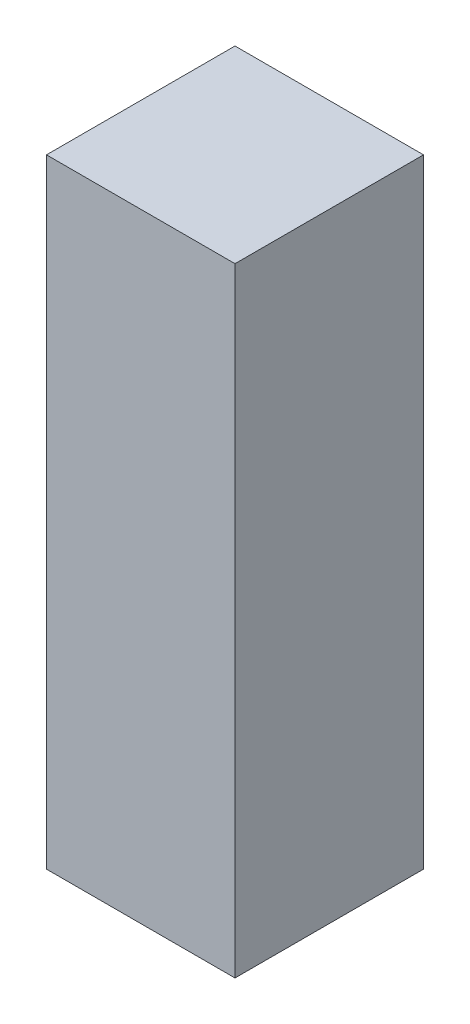
ISO-10303-21;
HEADER;
FILE_DESCRIPTION(('STEP AP214'),'2;1');
FILE_NAME('part.step','',(''),(''),'','','');
FILE_SCHEMA(('AUTOMOTIVE_DESIGN { 1 0 10303 214 1 1 1 1 }'));
ENDSEC;
DATA;
#1=APPLICATION_CONTEXT('core data for automotive mechanical design processes');
#2=APPLICATION_PROTOCOL_DEFINITION('international standard','automotive_design',2000,#1);
#3=PRODUCT_CONTEXT('',#1,'mechanical');
#4=PRODUCT('Part','Part','',(#3));
#5=PRODUCT_RELATED_PRODUCT_CATEGORY('part','',(#4));
#6=PRODUCT_DEFINITION_FORMATION('','',#4);
#7=PRODUCT_DEFINITION_CONTEXT('part definition',#1,'design');
#8=PRODUCT_DEFINITION('design','',#6,#7);
#9=PRODUCT_DEFINITION_SHAPE('','',#8);
#10=(LENGTH_UNIT() NAMED_UNIT(*) SI_UNIT(.MILLI.,.METRE.));
#11=(NAMED_UNIT(*) PLANE_ANGLE_UNIT() SI_UNIT($,.RADIAN.));
#12=(NAMED_UNIT(*) SI_UNIT($,.STERADIAN.) SOLID_ANGLE_UNIT());
#13=UNCERTAINTY_MEASURE_WITH_UNIT(LENGTH_MEASURE(1.E-05),#10,'distance_accuracy_value','');
#14=(GEOMETRIC_REPRESENTATION_CONTEXT(3) GLOBAL_UNCERTAINTY_ASSIGNED_CONTEXT((#13)) GLOBAL_UNIT_ASSIGNED_CONTEXT((#10,
#11,#12)) REPRESENTATION_CONTEXT('',''));
#15=CARTESIAN_POINT('',(0.,0.,0.));
#16=DIRECTION('',(0.,0.,1.));
#17=DIRECTION('',(1.,0.,0.));
#18=AXIS2_PLACEMENT_3D('',#15,#16,#17);
#19=CARTESIAN_POINT('',(0.,233.,0.));
#20=DIRECTION('',(1.,0.,0.));
#21=DIRECTION('',(0.,0.,-1.));
#22=AXIS2_PLACEMENT_3D('',#19,#20,#21);
#23=PLANE('',#22);
#24=DIRECTION('',(0.,0.,1.));
#25=VECTOR('',#24,1.);
#26=CARTESIAN_POINT('',(0.,0.,0.));
#27=LINE('',#26,#25);
#28=CARTESIAN_POINT('',(0.,0.,-71.));
#29=VERTEX_POINT('',#28);
#30=CARTESIAN_POINT('',(0.,0.,0.));
#31=VERTEX_POINT('',#30);
#32=EDGE_CURVE('E99',#29,#31,#27,.T.);
#33=ORIENTED_EDGE('',*,*,#32,.T.);
#34=DIRECTION('',(0.,-1.,0.));
#35=VECTOR('',#34,1.);
#36=CARTESIAN_POINT('',(0.,233.,0.));
#37=LINE('',#36,#35);
#38=CARTESIAN_POINT('',(0.,233.,0.));
#39=VERTEX_POINT('',#38);
#40=EDGE_CURVE('E11',#39,#31,#37,.T.);
#41=ORIENTED_EDGE('',*,*,#40,.F.);
#42=DIRECTION('',(0.,0.,1.));
#43=VECTOR('',#42,1.);
#44=CARTESIAN_POINT('',(0.,233.,0.));
#45=LINE('',#44,#43);
#46=CARTESIAN_POINT('',(0.,233.,-71.));
#47=VERTEX_POINT('',#46);
#48=EDGE_CURVE('E87',#47,#39,#45,.T.);
#49=ORIENTED_EDGE('',*,*,#48,.F.);
#50=DIRECTION('',(0.,-1.,0.));
#51=VECTOR('',#50,1.);
#52=CARTESIAN_POINT('',(0.,233.,-71.));
#53=LINE('',#52,#51);
#54=EDGE_CURVE('E95',#47,#29,#53,.T.);
#55=ORIENTED_EDGE('',*,*,#54,.T.);
#56=EDGE_LOOP('',(#33,#41,#49,#55));
#57=FACE_BOUND('',#56,.T.);
#58=ADVANCED_FACE('F36',(#57),#23,.F.);
#59=CARTESIAN_POINT('',(0.,233.,0.));
#60=DIRECTION('',(0.,0.,-1.));
#61=DIRECTION('',(-1.,0.,0.));
#62=AXIS2_PLACEMENT_3D('',#59,#60,#61);
#63=PLANE('',#62);
#64=DIRECTION('',(1.,0.,0.));
#65=VECTOR('',#64,1.);
#66=CARTESIAN_POINT('',(0.,0.,0.));
#67=LINE('',#66,#65);
#68=CARTESIAN_POINT('',(71.,0.,0.));
#69=VERTEX_POINT('',#68);
#70=EDGE_CURVE('E91',#31,#69,#67,.T.);
#71=ORIENTED_EDGE('',*,*,#70,.T.);
#72=DIRECTION('',(0.,-1.,0.));
#73=VECTOR('',#72,1.);
#74=CARTESIAN_POINT('',(71.,233.,0.));
#75=LINE('',#74,#73);
#76=CARTESIAN_POINT('',(71.,233.,0.));
#77=VERTEX_POINT('',#76);
#78=EDGE_CURVE('E44',#77,#69,#75,.T.);
#79=ORIENTED_EDGE('',*,*,#78,.F.);
#80=DIRECTION('',(1.,0.,0.));
#81=VECTOR('',#80,1.);
#82=CARTESIAN_POINT('',(0.,233.,0.));
#83=LINE('',#82,#81);
#84=EDGE_CURVE('E82',#39,#77,#83,.T.);
#85=ORIENTED_EDGE('',*,*,#84,.F.);
#86=ORIENTED_EDGE('',*,*,#40,.T.);
#87=EDGE_LOOP('',(#71,#79,#85,#86));
#88=FACE_BOUND('',#87,.T.);
#89=ADVANCED_FACE('F90',(#88),#63,.F.);
#90=CARTESIAN_POINT('',(71.,233.,0.));
#91=DIRECTION('',(-1.,0.,0.));
#92=DIRECTION('',(0.,0.,1.));
#93=AXIS2_PLACEMENT_3D('',#90,#91,#92);
#94=PLANE('',#93);
#95=DIRECTION('',(0.,0.,-1.));
#96=VECTOR('',#95,1.);
#97=CARTESIAN_POINT('',(71.,0.,0.));
#98=LINE('',#97,#96);
#99=CARTESIAN_POINT('',(71.,0.,-71.));
#100=VERTEX_POINT('',#99);
#101=EDGE_CURVE('E69',#69,#100,#98,.T.);
#102=ORIENTED_EDGE('',*,*,#101,.T.);
#103=DIRECTION('',(0.,-1.,0.));
#104=VECTOR('',#103,1.);
#105=CARTESIAN_POINT('',(71.,233.,-71.));
#106=LINE('',#105,#104);
#107=CARTESIAN_POINT('',(71.,233.,-71.));
#108=VERTEX_POINT('',#107);
#109=EDGE_CURVE('E92',#108,#100,#106,.T.);
#110=ORIENTED_EDGE('',*,*,#109,.F.);
#111=DIRECTION('',(0.,0.,-1.));
#112=VECTOR('',#111,1.);
#113=CARTESIAN_POINT('',(71.,233.,0.));
#114=LINE('',#113,#112);
#115=EDGE_CURVE('E85',#77,#108,#114,.T.);
#116=ORIENTED_EDGE('',*,*,#115,.F.);
#117=ORIENTED_EDGE('',*,*,#78,.T.);
#118=EDGE_LOOP('',(#102,#110,#116,#117));
#119=FACE_BOUND('',#118,.T.);
#120=ADVANCED_FACE('F93',(#119),#94,.F.);
#121=CARTESIAN_POINT('',(0.,233.,-71.));
#122=DIRECTION('',(0.,0.,1.));
#123=DIRECTION('',(1.,0.,0.));
#124=AXIS2_PLACEMENT_3D('',#121,#122,#123);
#125=PLANE('',#124);
#126=DIRECTION('',(-1.,0.,0.));
#127=VECTOR('',#126,1.);
#128=CARTESIAN_POINT('',(0.,0.,-71.));
#129=LINE('',#128,#127);
#130=EDGE_CURVE('E75',#100,#29,#129,.T.);
#131=ORIENTED_EDGE('',*,*,#130,.T.);
#132=ORIENTED_EDGE('',*,*,#54,.F.);
#133=DIRECTION('',(-1.,0.,0.));
#134=VECTOR('',#133,1.);
#135=CARTESIAN_POINT('',(0.,233.,-71.));
#136=LINE('',#135,#134);
#137=EDGE_CURVE('E52',#108,#47,#136,.T.);
#138=ORIENTED_EDGE('',*,*,#137,.F.);
#139=ORIENTED_EDGE('',*,*,#109,.T.);
#140=EDGE_LOOP('',(#131,#132,#138,#139));
#141=FACE_BOUND('',#140,.T.);
#142=ADVANCED_FACE('F106',(#141),#125,.F.);
#143=CARTESIAN_POINT('',(0.,233.,0.));
#144=DIRECTION('',(0.,-1.,0.));
#145=DIRECTION('',(0.,0.,-1.));
#146=AXIS2_PLACEMENT_3D('',#143,#144,#145);
#147=PLANE('',#146);
#148=ORIENTED_EDGE('',*,*,#48,.T.);
#149=ORIENTED_EDGE('',*,*,#84,.T.);
#150=ORIENTED_EDGE('',*,*,#115,.T.);
#151=ORIENTED_EDGE('',*,*,#137,.T.);
#152=EDGE_LOOP('',(#148,#149,#150,#151));
#153=FACE_BOUND('',#152,.T.);
#154=ADVANCED_FACE('F83',(#153),#147,.F.);
#155=CARTESIAN_POINT('',(0.,0.,0.));
#156=DIRECTION('',(0.,-1.,0.));
#157=DIRECTION('',(0.,0.,-1.));
#158=AXIS2_PLACEMENT_3D('',#155,#156,#157);
#159=PLANE('',#158);
#160=ORIENTED_EDGE('',*,*,#32,.F.);
#161=ORIENTED_EDGE('',*,*,#130,.F.);
#162=ORIENTED_EDGE('',*,*,#101,.F.);
#163=ORIENTED_EDGE('',*,*,#70,.F.);
#164=EDGE_LOOP('',(#160,#161,#162,#163));
#165=FACE_BOUND('',#164,.T.);
#166=ADVANCED_FACE('F109',(#165),#159,.T.);
#167=CLOSED_SHELL('',(#58,#89,#120,#142,#154,#166));
#168=MANIFOLD_SOLID_BREP('B2',#167);
#169=ADVANCED_BREP_SHAPE_REPRESENTATION('',(#18,#168),#14);
#170=SHAPE_DEFINITION_REPRESENTATION(#9,#169);
ENDSEC;
END-ISO-10303-21;
